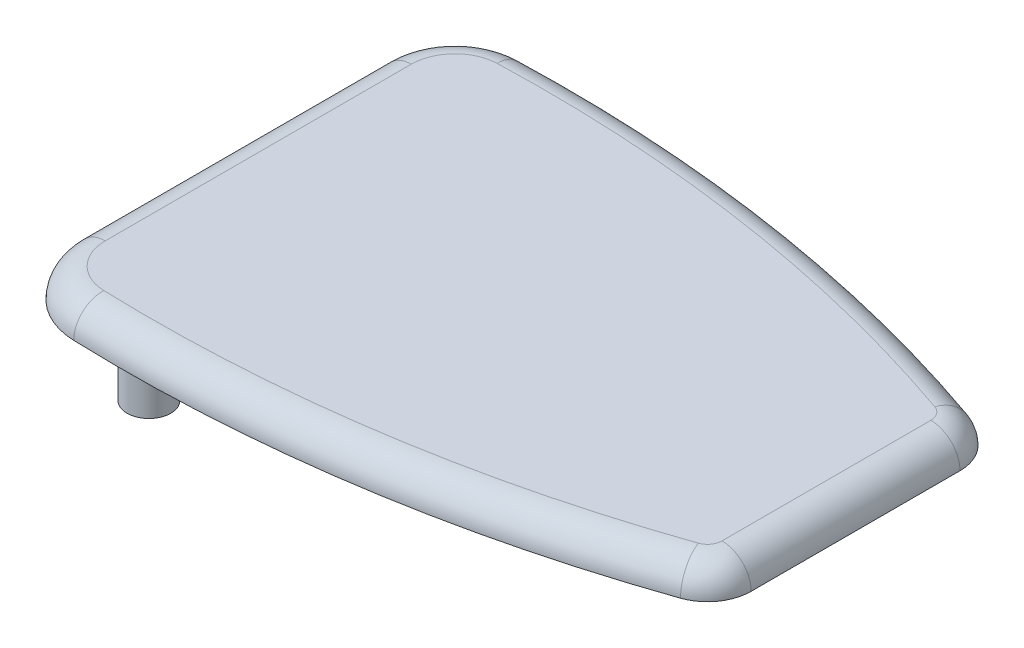
ISO-10303-21;
HEADER;
FILE_DESCRIPTION(('STEP AP214'),'2;1');
FILE_NAME('part.step','',(''),(''),'','','');
FILE_SCHEMA(('AUTOMOTIVE_DESIGN { 1 0 10303 214 1 1 1 1 }'));
ENDSEC;
DATA;
#1=APPLICATION_CONTEXT('core data for automotive mechanical design processes');
#2=APPLICATION_PROTOCOL_DEFINITION('international standard','automotive_design',2000,#1);
#3=PRODUCT_CONTEXT('',#1,'mechanical');
#4=PRODUCT('Part','Part','',(#3));
#5=PRODUCT_RELATED_PRODUCT_CATEGORY('part','',(#4));
#6=PRODUCT_DEFINITION_FORMATION('','',#4);
#7=PRODUCT_DEFINITION_CONTEXT('part definition',#1,'design');
#8=PRODUCT_DEFINITION('design','',#6,#7);
#9=PRODUCT_DEFINITION_SHAPE('','',#8);
#10=(LENGTH_UNIT() NAMED_UNIT(*) SI_UNIT(.MILLI.,.METRE.));
#11=(NAMED_UNIT(*) PLANE_ANGLE_UNIT() SI_UNIT($,.RADIAN.));
#12=(NAMED_UNIT(*) SI_UNIT($,.STERADIAN.) SOLID_ANGLE_UNIT());
#13=UNCERTAINTY_MEASURE_WITH_UNIT(LENGTH_MEASURE(1.E-05),#10,'distance_accuracy_value','');
#14=(GEOMETRIC_REPRESENTATION_CONTEXT(3) GLOBAL_UNCERTAINTY_ASSIGNED_CONTEXT((#13)) GLOBAL_UNIT_ASSIGNED_CONTEXT((#10,
#11,#12)) REPRESENTATION_CONTEXT('',''));
#15=CARTESIAN_POINT('',(0.,0.,0.));
#16=DIRECTION('',(0.,0.,1.));
#17=DIRECTION('',(1.,0.,0.));
#18=AXIS2_PLACEMENT_3D('',#15,#16,#17);
#19=CARTESIAN_POINT('',(-3.,1.,7.16662155553667));
#20=DIRECTION('',(0.,-1.,0.));
#21=DIRECTION('',(0.,0.,-1.));
#22=AXIS2_PLACEMENT_3D('',#19,#20,#21);
#23=PLANE('',#22);
#24=CARTESIAN_POINT('',(-38.,1.,10.5027025925611));
#25=DIRECTION('',(0.,-1.,0.));
#26=DIRECTION('',(0.,0.,-1.));
#27=AXIS2_PLACEMENT_3D('',#24,#25,#26);
#28=CIRCLE('',#27,3.00000000000001);
#29=CARTESIAN_POINT('',(-41.,1.,10.5027025925611));
#30=VERTEX_POINT('',#29);
#31=CARTESIAN_POINT('',(-38.098624052734,1.,13.5010810370245));
#32=VERTEX_POINT('',#31);
#33=EDGE_CURVE('E49',#30,#32,#28,.F.);
#34=ORIENTED_EDGE('',*,*,#33,.T.);
#35=CARTESIAN_POINT('',(-34.8769049967555,1.,-84.4459481487775));
#36=DIRECTION('',(0.,-1.,0.));
#37=DIRECTION('',(0.,0.,-1.));
#38=AXIS2_PLACEMENT_3D('',#35,#36,#37);
#39=CIRCLE('',#38,98.);
#40=CARTESIAN_POINT('',(-2.67137211343551,1.,8.11108103702445));
#41=VERTEX_POINT('',#40);
#42=EDGE_CURVE('E11',#32,#41,#39,.F.);
#43=ORIENTED_EDGE('',*,*,#42,.T.);
#44=CARTESIAN_POINT('',(-3.,1.,7.16662155553667));
#45=DIRECTION('',(0.,-1.,0.));
#46=DIRECTION('',(0.,0.,-1.));
#47=AXIS2_PLACEMENT_3D('',#44,#45,#46);
#48=CIRCLE('',#47,1.);
#49=CARTESIAN_POINT('',(-2.,1.,7.16662155553667));
#50=VERTEX_POINT('',#49);
#51=EDGE_CURVE('E162',#41,#50,#48,.F.);
#52=ORIENTED_EDGE('',*,*,#51,.T.);
#53=DIRECTION('',(0.,0.,-1.));
#54=VECTOR('',#53,1.);
#55=CARTESIAN_POINT('',(-2.,1.,7.16662155553667));
#56=LINE('',#55,#54);
#57=CARTESIAN_POINT('',(-2.,1.,-7.16662155553667));
#58=VERTEX_POINT('',#57);
#59=EDGE_CURVE('E122',#50,#58,#56,.T.);
#60=ORIENTED_EDGE('',*,*,#59,.T.);
#61=CARTESIAN_POINT('',(-3.,1.,-7.16662155553667));
#62=DIRECTION('',(0.,-1.,0.));
#63=DIRECTION('',(0.,0.,-1.));
#64=AXIS2_PLACEMENT_3D('',#61,#62,#63);
#65=CIRCLE('',#64,1.);
#66=CARTESIAN_POINT('',(-2.67137211343551,1.,-8.11108103702445));
#67=VERTEX_POINT('',#66);
#68=EDGE_CURVE('E167',#58,#67,#65,.F.);
#69=ORIENTED_EDGE('',*,*,#68,.T.);
#70=CARTESIAN_POINT('',(-34.8769049967555,1.,84.4459481487775));
#71=DIRECTION('',(0.,-1.,0.));
#72=DIRECTION('',(0.,0.,-1.));
#73=AXIS2_PLACEMENT_3D('',#70,#71,#72);
#74=CIRCLE('',#73,98.);
#75=CARTESIAN_POINT('',(-38.098624052734,1.,-13.5010810370244));
#76=VERTEX_POINT('',#75);
#77=EDGE_CURVE('E170',#67,#76,#74,.F.);
#78=ORIENTED_EDGE('',*,*,#77,.T.);
#79=CARTESIAN_POINT('',(-38.,1.,-10.5027025925611));
#80=DIRECTION('',(0.,-1.,0.));
#81=DIRECTION('',(0.,0.,-1.));
#82=AXIS2_PLACEMENT_3D('',#79,#80,#81);
#83=CIRCLE('',#82,3.);
#84=CARTESIAN_POINT('',(-41.,1.,-10.5027025925611));
#85=VERTEX_POINT('',#84);
#86=EDGE_CURVE('E173',#76,#85,#83,.F.);
#87=ORIENTED_EDGE('',*,*,#86,.T.);
#88=DIRECTION('',(0.,0.,1.));
#89=VECTOR('',#88,1.);
#90=CARTESIAN_POINT('',(-41.,1.,7.16662155553667));
#91=LINE('',#90,#89);
#92=EDGE_CURVE('E60',#85,#30,#91,.T.);
#93=ORIENTED_EDGE('',*,*,#92,.T.);
#94=EDGE_LOOP('',(#34,#43,#52,#60,#69,#78,#87,#93));
#95=FACE_BOUND('',#94,.T.);
#96=ADVANCED_FACE('F39',(#95),#23,.F.);
#97=CARTESIAN_POINT('',(-3.,-1.,7.16662155553667));
#98=DIRECTION('',(0.,-1.,0.));
#99=DIRECTION('',(0.,0.,-1.));
#100=AXIS2_PLACEMENT_3D('',#97,#98,#99);
#101=PLANE('',#100);
#102=CARTESIAN_POINT('',(-38.,-1.,-10.5027025925611));
#103=DIRECTION('',(0.,-1.,0.));
#104=DIRECTION('',(0.,0.,-1.));
#105=AXIS2_PLACEMENT_3D('',#102,#103,#104);
#106=CIRCLE('',#105,2.5);
#107=CARTESIAN_POINT('',(-38.,-1.,-13.0027025925611));
#108=VERTEX_POINT('',#107);
#109=EDGE_CURVE('E219',#108,#108,#106,.T.);
#110=ORIENTED_EDGE('',*,*,#109,.F.);
#111=EDGE_LOOP('',(#110));
#112=FACE_BOUND('',#111,.T.);
#113=CARTESIAN_POINT('',(-38.,-1.,10.5027025925611));
#114=DIRECTION('',(0.,-1.,0.));
#115=DIRECTION('',(0.,0.,-1.));
#116=AXIS2_PLACEMENT_3D('',#113,#114,#115);
#117=CIRCLE('',#116,2.5);
#118=CARTESIAN_POINT('',(-38.,-1.,8.00270259256112));
#119=VERTEX_POINT('',#118);
#120=EDGE_CURVE('E231',#119,#119,#117,.T.);
#121=ORIENTED_EDGE('',*,*,#120,.F.);
#122=EDGE_LOOP('',(#121));
#123=FACE_BOUND('',#122,.T.);
#124=CARTESIAN_POINT('',(-8.,-1.,0.));
#125=DIRECTION('',(0.,-1.,0.));
#126=DIRECTION('',(0.,0.,-1.));
#127=AXIS2_PLACEMENT_3D('',#124,#125,#126);
#128=CIRCLE('',#127,2.5);
#129=CARTESIAN_POINT('',(-8.,-1.,-2.5));
#130=VERTEX_POINT('',#129);
#131=EDGE_CURVE('E137',#130,#130,#128,.T.);
#132=ORIENTED_EDGE('',*,*,#131,.F.);
#133=EDGE_LOOP('',(#132));
#134=FACE_BOUND('',#133,.T.);
#135=CARTESIAN_POINT('',(-3.,-1.,7.16662155553667));
#136=DIRECTION('',(0.,1.,0.));
#137=DIRECTION('',(0.,0.,-1.));
#138=AXIS2_PLACEMENT_3D('',#135,#136,#137);
#139=CIRCLE('',#138,3.);
#140=CARTESIAN_POINT('',(-2.01411634030654,-1.,9.99999999999999));
#141=VERTEX_POINT('',#140);
#142=CARTESIAN_POINT('',(0.,-1.,7.16662155553667));
#143=VERTEX_POINT('',#142);
#144=EDGE_CURVE('E109',#141,#143,#139,.T.);
#145=ORIENTED_EDGE('',*,*,#144,.F.);
#146=CARTESIAN_POINT('',(-34.8769049967555,-1.,-84.4459481487775));
#147=DIRECTION('',(0.,1.,0.));
#148=DIRECTION('',(0.,0.,-1.));
#149=AXIS2_PLACEMENT_3D('',#146,#147,#148);
#150=CIRCLE('',#149,100.);
#151=CARTESIAN_POINT('',(-38.1643734212234,-1.,15.5));
#152=VERTEX_POINT('',#151);
#153=EDGE_CURVE('E159',#152,#141,#150,.T.);
#154=ORIENTED_EDGE('',*,*,#153,.F.);
#155=CARTESIAN_POINT('',(-38.,-1.,10.5027025925611));
#156=DIRECTION('',(0.,1.,0.));
#157=DIRECTION('',(0.,0.,-1.));
#158=AXIS2_PLACEMENT_3D('',#155,#156,#157);
#159=CIRCLE('',#158,5.00000000000001);
#160=CARTESIAN_POINT('',(-43.,-1.,10.5027025925611));
#161=VERTEX_POINT('',#160);
#162=EDGE_CURVE('E155',#161,#152,#159,.T.);
#163=ORIENTED_EDGE('',*,*,#162,.F.);
#164=DIRECTION('',(0.,0.,1.));
#165=VECTOR('',#164,1.);
#166=CARTESIAN_POINT('',(-43.,-1.,-10.5027025925611));
#167=LINE('',#166,#165);
#168=CARTESIAN_POINT('',(-43.,-1.,-10.5027025925611));
#169=VERTEX_POINT('',#168);
#170=EDGE_CURVE('E151',#169,#161,#167,.T.);
#171=ORIENTED_EDGE('',*,*,#170,.F.);
#172=CARTESIAN_POINT('',(-38.,-1.,-10.5027025925611));
#173=DIRECTION('',(0.,1.,0.));
#174=DIRECTION('',(0.,0.,1.));
#175=AXIS2_PLACEMENT_3D('',#172,#173,#174);
#176=CIRCLE('',#175,5.);
#177=CARTESIAN_POINT('',(-38.1643734212234,-1.,-15.5));
#178=VERTEX_POINT('',#177);
#179=EDGE_CURVE('E147',#178,#169,#176,.T.);
#180=ORIENTED_EDGE('',*,*,#179,.F.);
#181=CARTESIAN_POINT('',(-34.8769049967555,-1.,84.4459481487775));
#182=DIRECTION('',(0.,1.,0.));
#183=DIRECTION('',(0.,0.,1.));
#184=AXIS2_PLACEMENT_3D('',#181,#182,#183);
#185=CIRCLE('',#184,100.);
#186=CARTESIAN_POINT('',(-2.01411634030653,-1.,-10.));
#187=VERTEX_POINT('',#186);
#188=EDGE_CURVE('E143',#187,#178,#185,.T.);
#189=ORIENTED_EDGE('',*,*,#188,.F.);
#190=CARTESIAN_POINT('',(-3.,-1.,-7.16662155553667));
#191=DIRECTION('',(0.,1.,0.));
#192=DIRECTION('',(0.,0.,1.));
#193=AXIS2_PLACEMENT_3D('',#190,#191,#192);
#194=CIRCLE('',#193,3.);
#195=CARTESIAN_POINT('',(0.,-1.,-7.16662155553667));
#196=VERTEX_POINT('',#195);
#197=EDGE_CURVE('E112',#196,#187,#194,.T.);
#198=ORIENTED_EDGE('',*,*,#197,.F.);
#199=DIRECTION('',(0.,0.,-1.));
#200=VECTOR('',#199,1.);
#201=CARTESIAN_POINT('',(0.,-1.,7.16662155553667));
#202=LINE('',#201,#200);
#203=EDGE_CURVE('E104',#143,#196,#202,.T.);
#204=ORIENTED_EDGE('',*,*,#203,.F.);
#205=EDGE_LOOP('',(#145,#154,#163,#171,#180,#189,#198,#204));
#206=FACE_BOUND('',#205,.T.);
#207=ADVANCED_FACE('F106',(#112,#123,#134,#206),#101,.T.);
#208=CARTESIAN_POINT('',(-8.,-2.,0.));
#209=DIRECTION('',(0.,-1.,0.));
#210=DIRECTION('',(0.,0.,-1.));
#211=AXIS2_PLACEMENT_3D('',#208,#209,#210);
#212=PLANE('',#211);
#213=CARTESIAN_POINT('',(-8.,-2.,0.));
#214=DIRECTION('',(0.,-1.,0.));
#215=DIRECTION('',(0.,0.,-1.));
#216=AXIS2_PLACEMENT_3D('',#213,#214,#215);
#217=CIRCLE('',#216,2.5);
#218=CARTESIAN_POINT('',(-8.,-2.,-2.5));
#219=VERTEX_POINT('',#218);
#220=EDGE_CURVE('E133',#219,#219,#217,.T.);
#221=ORIENTED_EDGE('',*,*,#220,.T.);
#222=EDGE_LOOP('',(#221));
#223=FACE_BOUND('',#222,.T.);
#224=CARTESIAN_POINT('',(-8.,-2.,0.));
#225=DIRECTION('',(0.,-1.,0.));
#226=DIRECTION('',(0.,0.,-1.));
#227=AXIS2_PLACEMENT_3D('',#224,#225,#226);
#228=CIRCLE('',#227,1.5);
#229=CARTESIAN_POINT('',(-8.,-2.,-1.5));
#230=VERTEX_POINT('',#229);
#231=EDGE_CURVE('E243',#230,#230,#228,.T.);
#232=ORIENTED_EDGE('',*,*,#231,.F.);
#233=EDGE_LOOP('',(#232));
#234=FACE_BOUND('',#233,.T.);
#235=ADVANCED_FACE('F255',(#223,#234),#212,.T.);
#236=CARTESIAN_POINT('',(-8.,-2.,0.));
#237=DIRECTION('',(0.,1.,0.));
#238=DIRECTION('',(0.,0.,1.));
#239=AXIS2_PLACEMENT_3D('',#236,#237,#238);
#240=CYLINDRICAL_SURFACE('',#239,2.5);
#241=ORIENTED_EDGE('',*,*,#220,.F.);
#242=EDGE_LOOP('',(#241));
#243=FACE_BOUND('',#242,.T.);
#244=ORIENTED_EDGE('',*,*,#131,.T.);
#245=EDGE_LOOP('',(#244));
#246=FACE_BOUND('',#245,.T.);
#247=ADVANCED_FACE('F252',(#243,#246),#240,.T.);
#248=CARTESIAN_POINT('',(-8.,-7.,0.));
#249=DIRECTION('',(0.,1.,0.));
#250=DIRECTION('',(0.,0.,1.));
#251=AXIS2_PLACEMENT_3D('',#248,#249,#250);
#252=CYLINDRICAL_SURFACE('',#251,1.5);
#253=ORIENTED_EDGE('',*,*,#231,.T.);
#254=EDGE_LOOP('',(#253));
#255=FACE_BOUND('',#254,.T.);
#256=CARTESIAN_POINT('',(-8.,-7.,0.));
#257=DIRECTION('',(0.,-1.,0.));
#258=DIRECTION('',(0.,0.,-1.));
#259=AXIS2_PLACEMENT_3D('',#256,#257,#258);
#260=CIRCLE('',#259,1.5);
#261=CARTESIAN_POINT('',(-8.,-7.,-1.5));
#262=VERTEX_POINT('',#261);
#263=EDGE_CURVE('E236',#262,#262,#260,.T.);
#264=ORIENTED_EDGE('',*,*,#263,.F.);
#265=EDGE_LOOP('',(#264));
#266=FACE_BOUND('',#265,.T.);
#267=ADVANCED_FACE('F335',(#255,#266),#252,.T.);
#268=CARTESIAN_POINT('',(0.,-7.,0.));
#269=DIRECTION('',(0.,-1.,0.));
#270=DIRECTION('',(0.,0.,-1.));
#271=AXIS2_PLACEMENT_3D('',#268,#269,#270);
#272=PLANE('',#271);
#273=ORIENTED_EDGE('',*,*,#263,.T.);
#274=EDGE_LOOP('',(#273));
#275=FACE_BOUND('',#274,.T.);
#276=ADVANCED_FACE('F328',(#275),#272,.T.);
#277=CARTESIAN_POINT('',(-38.,-2.,10.5027025925611));
#278=DIRECTION('',(0.,-1.,0.));
#279=DIRECTION('',(0.,0.,-1.));
#280=AXIS2_PLACEMENT_3D('',#277,#278,#279);
#281=PLANE('',#280);
#282=CARTESIAN_POINT('',(-38.,-2.,10.5027025925611));
#283=DIRECTION('',(0.,-1.,0.));
#284=DIRECTION('',(0.,0.,-1.));
#285=AXIS2_PLACEMENT_3D('',#282,#283,#284);
#286=CIRCLE('',#285,2.5);
#287=CARTESIAN_POINT('',(-38.,-2.,8.00270259256112));
#288=VERTEX_POINT('',#287);
#289=EDGE_CURVE('E232',#288,#288,#286,.T.);
#290=ORIENTED_EDGE('',*,*,#289,.T.);
#291=EDGE_LOOP('',(#290));
#292=FACE_BOUND('',#291,.T.);
#293=CARTESIAN_POINT('',(-38.,-2.,10.5027025925611));
#294=DIRECTION('',(0.,-1.,0.));
#295=DIRECTION('',(0.,0.,-1.));
#296=AXIS2_PLACEMENT_3D('',#293,#294,#295);
#297=CIRCLE('',#296,1.5);
#298=CARTESIAN_POINT('',(-38.,-2.,9.00270259256112));
#299=VERTEX_POINT('',#298);
#300=EDGE_CURVE('E224',#299,#299,#297,.T.);
#301=ORIENTED_EDGE('',*,*,#300,.F.);
#302=EDGE_LOOP('',(#301));
#303=FACE_BOUND('',#302,.T.);
#304=ADVANCED_FACE('F325',(#292,#303),#281,.T.);
#305=CARTESIAN_POINT('',(-38.,-2.,10.5027025925611));
#306=DIRECTION('',(0.,1.,0.));
#307=DIRECTION('',(0.,0.,1.));
#308=AXIS2_PLACEMENT_3D('',#305,#306,#307);
#309=CYLINDRICAL_SURFACE('',#308,2.5);
#310=ORIENTED_EDGE('',*,*,#289,.F.);
#311=EDGE_LOOP('',(#310));
#312=FACE_BOUND('',#311,.T.);
#313=ORIENTED_EDGE('',*,*,#120,.T.);
#314=EDGE_LOOP('',(#313));
#315=FACE_BOUND('',#314,.T.);
#316=ADVANCED_FACE('F320',(#312,#315),#309,.T.);
#317=CARTESIAN_POINT('',(-38.,-2.,-10.5027025925611));
#318=DIRECTION('',(0.,-1.,0.));
#319=DIRECTION('',(0.,0.,-1.));
#320=AXIS2_PLACEMENT_3D('',#317,#318,#319);
#321=PLANE('',#320);
#322=CARTESIAN_POINT('',(-38.,-2.,-10.5027025925611));
#323=DIRECTION('',(0.,-1.,0.));
#324=DIRECTION('',(0.,0.,-1.));
#325=AXIS2_PLACEMENT_3D('',#322,#323,#324);
#326=CIRCLE('',#325,2.5);
#327=CARTESIAN_POINT('',(-38.,-2.,-13.0027025925611));
#328=VERTEX_POINT('',#327);
#329=EDGE_CURVE('E220',#328,#328,#326,.T.);
#330=ORIENTED_EDGE('',*,*,#329,.T.);
#331=EDGE_LOOP('',(#330));
#332=FACE_BOUND('',#331,.T.);
#333=CARTESIAN_POINT('',(-38.,-2.,-10.5027025925611));
#334=DIRECTION('',(0.,-1.,0.));
#335=DIRECTION('',(0.,0.,-1.));
#336=AXIS2_PLACEMENT_3D('',#333,#334,#335);
#337=CIRCLE('',#336,1.5);
#338=CARTESIAN_POINT('',(-38.,-2.,-12.0027025925611));
#339=VERTEX_POINT('',#338);
#340=EDGE_CURVE('E213',#339,#339,#337,.T.);
#341=ORIENTED_EDGE('',*,*,#340,.F.);
#342=EDGE_LOOP('',(#341));
#343=FACE_BOUND('',#342,.T.);
#344=ADVANCED_FACE('F317',(#332,#343),#321,.T.);
#345=CARTESIAN_POINT('',(-38.,-2.,-10.5027025925611));
#346=DIRECTION('',(0.,1.,0.));
#347=DIRECTION('',(0.,0.,1.));
#348=AXIS2_PLACEMENT_3D('',#345,#346,#347);
#349=CYLINDRICAL_SURFACE('',#348,2.5);
#350=ORIENTED_EDGE('',*,*,#329,.F.);
#351=EDGE_LOOP('',(#350));
#352=FACE_BOUND('',#351,.T.);
#353=ORIENTED_EDGE('',*,*,#109,.T.);
#354=EDGE_LOOP('',(#353));
#355=FACE_BOUND('',#354,.T.);
#356=ADVANCED_FACE('F315',(#352,#355),#349,.T.);
#357=CARTESIAN_POINT('',(-38.,-7.,10.5027025925611));
#358=DIRECTION('',(0.,1.,0.));
#359=DIRECTION('',(0.,0.,1.));
#360=AXIS2_PLACEMENT_3D('',#357,#358,#359);
#361=CYLINDRICAL_SURFACE('',#360,1.5);
#362=ORIENTED_EDGE('',*,*,#300,.T.);
#363=EDGE_LOOP('',(#362));
#364=FACE_BOUND('',#363,.T.);
#365=CARTESIAN_POINT('',(-38.,-7.,10.5027025925611));
#366=DIRECTION('',(0.,-1.,0.));
#367=DIRECTION('',(0.,0.,-1.));
#368=AXIS2_PLACEMENT_3D('',#365,#366,#367);
#369=CIRCLE('',#368,1.5);
#370=CARTESIAN_POINT('',(-38.,-7.,9.00270259256112));
#371=VERTEX_POINT('',#370);
#372=EDGE_CURVE('E207',#371,#371,#369,.T.);
#373=ORIENTED_EDGE('',*,*,#372,.F.);
#374=EDGE_LOOP('',(#373));
#375=FACE_BOUND('',#374,.T.);
#376=ADVANCED_FACE('F311',(#364,#375),#361,.T.);
#377=CARTESIAN_POINT('',(-30.,-7.,10.5027025925611));
#378=DIRECTION('',(0.,-1.,0.));
#379=DIRECTION('',(0.,0.,-1.));
#380=AXIS2_PLACEMENT_3D('',#377,#378,#379);
#381=PLANE('',#380);
#382=ORIENTED_EDGE('',*,*,#372,.T.);
#383=EDGE_LOOP('',(#382));
#384=FACE_BOUND('',#383,.T.);
#385=ADVANCED_FACE('F305',(#384),#381,.T.);
#386=CARTESIAN_POINT('',(-38.,-7.,-10.5027025925611));
#387=DIRECTION('',(0.,1.,0.));
#388=DIRECTION('',(0.,0.,1.));
#389=AXIS2_PLACEMENT_3D('',#386,#387,#388);
#390=CYLINDRICAL_SURFACE('',#389,1.5);
#391=ORIENTED_EDGE('',*,*,#340,.T.);
#392=EDGE_LOOP('',(#391));
#393=FACE_BOUND('',#392,.T.);
#394=CARTESIAN_POINT('',(-38.,-7.,-10.5027025925611));
#395=DIRECTION('',(0.,-1.,0.));
#396=DIRECTION('',(0.,0.,-1.));
#397=AXIS2_PLACEMENT_3D('',#394,#395,#396);
#398=CIRCLE('',#397,1.5);
#399=CARTESIAN_POINT('',(-38.,-7.,-12.0027025925611));
#400=VERTEX_POINT('',#399);
#401=EDGE_CURVE('E201',#400,#400,#398,.T.);
#402=ORIENTED_EDGE('',*,*,#401,.F.);
#403=EDGE_LOOP('',(#402));
#404=FACE_BOUND('',#403,.T.);
#405=ADVANCED_FACE('F297',(#393,#404),#390,.T.);
#406=CARTESIAN_POINT('',(-30.,-7.,-10.5027025925611));
#407=DIRECTION('',(0.,-1.,0.));
#408=DIRECTION('',(0.,0.,-1.));
#409=AXIS2_PLACEMENT_3D('',#406,#407,#408);
#410=PLANE('',#409);
#411=ORIENTED_EDGE('',*,*,#401,.T.);
#412=EDGE_LOOP('',(#411));
#413=FACE_BOUND('',#412,.T.);
#414=ADVANCED_FACE('F292',(#413),#410,.T.);
#415=CARTESIAN_POINT('',(-34.8769049967555,-1.,84.4459481487775));
#416=DIRECTION('',(0.,-1.,0.));
#417=DIRECTION('',(0.,0.,-1.));
#418=AXIS2_PLACEMENT_3D('',#415,#416,#417);
#419=TOROIDAL_SURFACE('',#418,98.,2.);
#420=CARTESIAN_POINT('',(-2.67137211343551,-1.,-8.11108103702445));
#421=DIRECTION('',(0.944459481487775,0.,0.328627886564489));
#422=DIRECTION('',(0.328627886564489,0.,-0.944459481487775));
#423=AXIS2_PLACEMENT_3D('',#420,#421,#422);
#424=CIRCLE('',#423,2.);
#425=EDGE_CURVE('E193',#187,#67,#424,.T.);
#426=ORIENTED_EDGE('',*,*,#425,.F.);
#427=ORIENTED_EDGE('',*,*,#188,.T.);
#428=CARTESIAN_POINT('',(-38.098624052734,-1.,-13.5010810370244));
#429=DIRECTION('',(-0.999459481487775,0.,0.032874684244677));
#430=DIRECTION('',(0.032874684244677,0.,0.999459481487776));
#431=AXIS2_PLACEMENT_3D('',#428,#429,#430);
#432=CIRCLE('',#431,2.);
#433=EDGE_CURVE('E43',#76,#178,#432,.T.);
#434=ORIENTED_EDGE('',*,*,#433,.F.);
#435=ORIENTED_EDGE('',*,*,#77,.F.);
#436=EDGE_LOOP('',(#426,#427,#434,#435));
#437=FACE_BOUND('',#436,.T.);
#438=ADVANCED_FACE('F41',(#437),#419,.T.);
#439=CARTESIAN_POINT('',(-38.,-1.,-10.5027025925611));
#440=DIRECTION('',(0.,-1.,0.));
#441=DIRECTION('',(0.,0.,-1.));
#442=AXIS2_PLACEMENT_3D('',#439,#440,#441);
#443=TOROIDAL_SURFACE('',#442,3.,2.);
#444=ORIENTED_EDGE('',*,*,#433,.T.);
#445=ORIENTED_EDGE('',*,*,#179,.T.);
#446=CARTESIAN_POINT('',(-41.,-1.,-10.5027025925611));
#447=DIRECTION('',(0.,0.,1.));
#448=DIRECTION('',(1.,0.,0.));
#449=AXIS2_PLACEMENT_3D('',#446,#447,#448);
#450=CIRCLE('',#449,2.);
#451=EDGE_CURVE('E190',#85,#169,#450,.T.);
#452=ORIENTED_EDGE('',*,*,#451,.F.);
#453=ORIENTED_EDGE('',*,*,#86,.F.);
#454=EDGE_LOOP('',(#444,#445,#452,#453));
#455=FACE_BOUND('',#454,.T.);
#456=ADVANCED_FACE('F287',(#455),#443,.T.);
#457=CARTESIAN_POINT('',(-3.,-1.,-7.16662155553667));
#458=DIRECTION('',(0.,-1.,0.));
#459=DIRECTION('',(0.,0.,-1.));
#460=AXIS2_PLACEMENT_3D('',#457,#458,#459);
#461=DEGENERATE_TOROIDAL_SURFACE('',#460,1.,2.,.T.);
#462=ORIENTED_EDGE('',*,*,#425,.T.);
#463=ORIENTED_EDGE('',*,*,#68,.F.);
#464=CARTESIAN_POINT('',(-2.,-1.,-7.16662155553667));
#465=DIRECTION('',(0.,0.,1.));
#466=DIRECTION('',(1.,0.,0.));
#467=AXIS2_PLACEMENT_3D('',#464,#465,#466);
#468=CIRCLE('',#467,2.);
#469=EDGE_CURVE('E187',#196,#58,#468,.T.);
#470=ORIENTED_EDGE('',*,*,#469,.F.);
#471=ORIENTED_EDGE('',*,*,#197,.T.);
#472=EDGE_LOOP('',(#462,#463,#470,#471));
#473=FACE_BOUND('',#472,.T.);
#474=ADVANCED_FACE('F284',(#473),#461,.T.);
#475=CARTESIAN_POINT('',(-41.,-1.,7.16662155553667));
#476=DIRECTION('',(0.,0.,1.));
#477=DIRECTION('',(1.,0.,0.));
#478=AXIS2_PLACEMENT_3D('',#475,#476,#477);
#479=CYLINDRICAL_SURFACE('',#478,2.);
#480=ORIENTED_EDGE('',*,*,#451,.T.);
#481=ORIENTED_EDGE('',*,*,#170,.T.);
#482=CARTESIAN_POINT('',(-41.,-1.,10.5027025925611));
#483=DIRECTION('',(0.,0.,1.));
#484=DIRECTION('',(1.,0.,0.));
#485=AXIS2_PLACEMENT_3D('',#482,#483,#484);
#486=CIRCLE('',#485,2.);
#487=EDGE_CURVE('E126',#30,#161,#486,.T.);
#488=ORIENTED_EDGE('',*,*,#487,.F.);
#489=ORIENTED_EDGE('',*,*,#92,.F.);
#490=EDGE_LOOP('',(#480,#481,#488,#489));
#491=FACE_BOUND('',#490,.T.);
#492=ADVANCED_FACE('F281',(#491),#479,.T.);
#493=CARTESIAN_POINT('',(-2.,-1.,7.16662155553667));
#494=DIRECTION('',(0.,0.,-1.));
#495=DIRECTION('',(-1.,0.,0.));
#496=AXIS2_PLACEMENT_3D('',#493,#494,#495);
#497=CYLINDRICAL_SURFACE('',#496,2.);
#498=ORIENTED_EDGE('',*,*,#469,.T.);
#499=ORIENTED_EDGE('',*,*,#59,.F.);
#500=CARTESIAN_POINT('',(-2.,-1.,7.16662155553667));
#501=DIRECTION('',(0.,0.,1.));
#502=DIRECTION('',(1.,0.,0.));
#503=AXIS2_PLACEMENT_3D('',#500,#501,#502);
#504=CIRCLE('',#503,2.);
#505=EDGE_CURVE('E120',#143,#50,#504,.T.);
#506=ORIENTED_EDGE('',*,*,#505,.F.);
#507=ORIENTED_EDGE('',*,*,#203,.T.);
#508=EDGE_LOOP('',(#498,#499,#506,#507));
#509=FACE_BOUND('',#508,.T.);
#510=ADVANCED_FACE('F121',(#509),#497,.T.);
#511=CARTESIAN_POINT('',(-38.,-1.,10.5027025925611));
#512=DIRECTION('',(0.,-1.,0.));
#513=DIRECTION('',(0.,0.,-1.));
#514=AXIS2_PLACEMENT_3D('',#511,#512,#513);
#515=TOROIDAL_SURFACE('',#514,3.00000000000001,2.);
#516=ORIENTED_EDGE('',*,*,#487,.T.);
#517=ORIENTED_EDGE('',*,*,#162,.T.);
#518=CARTESIAN_POINT('',(-38.098624052734,-1.,13.5010810370245));
#519=DIRECTION('',(0.999459481487775,0.,0.0328746842446805));
#520=DIRECTION('',(0.0328746842446805,0.,-0.999459481487775));
#521=AXIS2_PLACEMENT_3D('',#518,#519,#520);
#522=CIRCLE('',#521,2.);
#523=EDGE_CURVE('E127',#32,#152,#522,.T.);
#524=ORIENTED_EDGE('',*,*,#523,.F.);
#525=ORIENTED_EDGE('',*,*,#33,.F.);
#526=EDGE_LOOP('',(#516,#517,#524,#525));
#527=FACE_BOUND('',#526,.T.);
#528=ADVANCED_FACE('F275',(#527),#515,.T.);
#529=CARTESIAN_POINT('',(-3.,-1.,7.16662155553667));
#530=DIRECTION('',(0.,-1.,0.));
#531=DIRECTION('',(0.,0.,-1.));
#532=AXIS2_PLACEMENT_3D('',#529,#530,#531);
#533=DEGENERATE_TOROIDAL_SURFACE('',#532,1.,2.,.T.);
#534=ORIENTED_EDGE('',*,*,#505,.T.);
#535=ORIENTED_EDGE('',*,*,#51,.F.);
#536=CARTESIAN_POINT('',(-2.67137211343551,-1.,8.11108103702445));
#537=DIRECTION('',(-0.944459481487775,0.,0.328627886564488));
#538=DIRECTION('',(0.328627886564488,0.,0.944459481487776));
#539=AXIS2_PLACEMENT_3D('',#536,#537,#538);
#540=CIRCLE('',#539,2.);
#541=EDGE_CURVE('E131',#141,#41,#540,.T.);
#542=ORIENTED_EDGE('',*,*,#541,.F.);
#543=ORIENTED_EDGE('',*,*,#144,.T.);
#544=EDGE_LOOP('',(#534,#535,#542,#543));
#545=FACE_BOUND('',#544,.T.);
#546=ADVANCED_FACE('F130',(#545),#533,.T.);
#547=CARTESIAN_POINT('',(-34.8769049967555,-1.,-84.4459481487775));
#548=DIRECTION('',(0.,-1.,0.));
#549=DIRECTION('',(0.,0.,-1.));
#550=AXIS2_PLACEMENT_3D('',#547,#548,#549);
#551=TOROIDAL_SURFACE('',#550,98.,2.);
#552=ORIENTED_EDGE('',*,*,#523,.T.);
#553=ORIENTED_EDGE('',*,*,#153,.T.);
#554=ORIENTED_EDGE('',*,*,#541,.T.);
#555=ORIENTED_EDGE('',*,*,#42,.F.);
#556=EDGE_LOOP('',(#552,#553,#554,#555));
#557=FACE_BOUND('',#556,.T.);
#558=ADVANCED_FACE('F269',(#557),#551,.T.);
#559=CLOSED_SHELL('',(#96,#207,#235,#247,#267,#276,#304,#316,#344,#356,#376,#385,#405,#414,#438,
#456,#474,#492,#510,#528,#546,#558));
#560=MANIFOLD_SOLID_BREP('B2',#559);
#561=ADVANCED_BREP_SHAPE_REPRESENTATION('',(#18,#560),#14);
#562=SHAPE_DEFINITION_REPRESENTATION(#9,#561);
ENDSEC;
END-ISO-10303-21;
